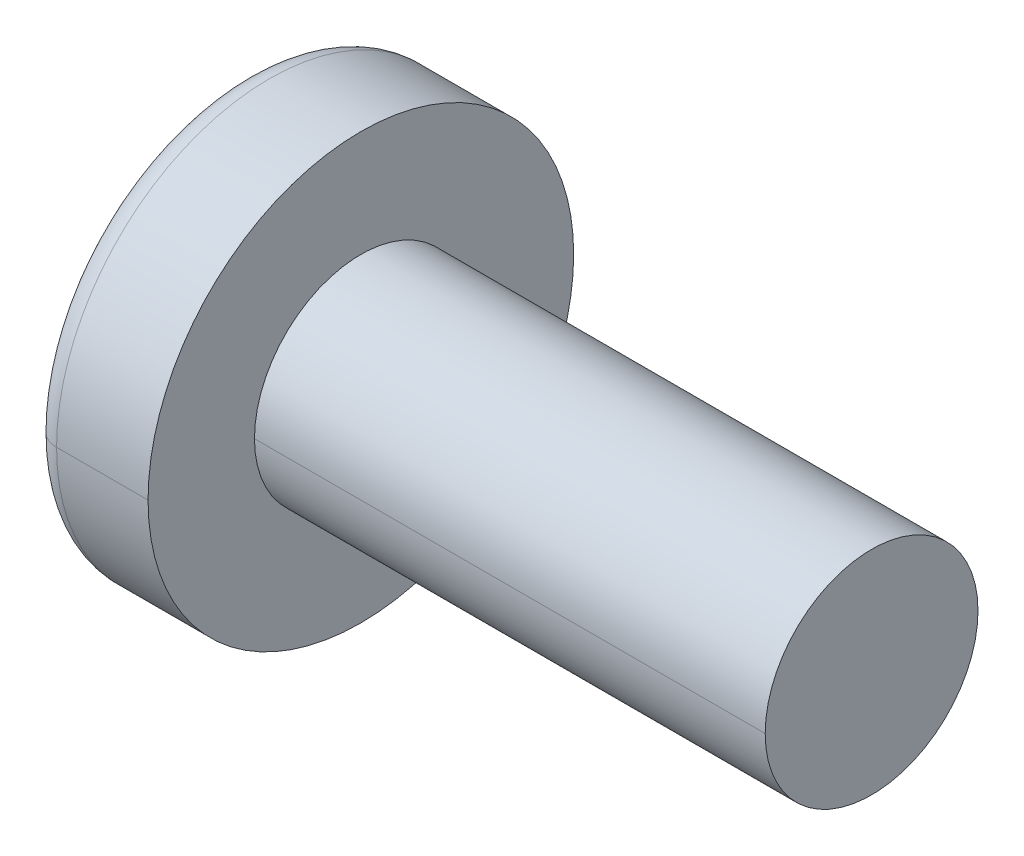
ISO-10303-21;
HEADER;
FILE_DESCRIPTION(('STEP AP214'),'2;1');
FILE_NAME('part.step','',(''),(''),'','','');
FILE_SCHEMA(('AUTOMOTIVE_DESIGN { 1 0 10303 214 1 1 1 1 }'));
ENDSEC;
DATA;
#1=APPLICATION_CONTEXT('core data for automotive mechanical design processes');
#2=APPLICATION_PROTOCOL_DEFINITION('international standard','automotive_design',2000,#1);
#3=PRODUCT_CONTEXT('',#1,'mechanical');
#4=PRODUCT('Part','Part','',(#3));
#5=PRODUCT_RELATED_PRODUCT_CATEGORY('part','',(#4));
#6=PRODUCT_DEFINITION_FORMATION('','',#4);
#7=PRODUCT_DEFINITION_CONTEXT('part definition',#1,'design');
#8=PRODUCT_DEFINITION('design','',#6,#7);
#9=PRODUCT_DEFINITION_SHAPE('','',#8);
#10=(LENGTH_UNIT() NAMED_UNIT(*) SI_UNIT(.MILLI.,.METRE.));
#11=(NAMED_UNIT(*) PLANE_ANGLE_UNIT() SI_UNIT($,.RADIAN.));
#12=(NAMED_UNIT(*) SI_UNIT($,.STERADIAN.) SOLID_ANGLE_UNIT());
#13=UNCERTAINTY_MEASURE_WITH_UNIT(LENGTH_MEASURE(1.E-05),#10,'distance_accuracy_value','');
#14=(GEOMETRIC_REPRESENTATION_CONTEXT(3) GLOBAL_UNCERTAINTY_ASSIGNED_CONTEXT((#13)) GLOBAL_UNIT_ASSIGNED_CONTEXT((#10,
#11,#12)) REPRESENTATION_CONTEXT('',''));
#15=CARTESIAN_POINT('',(0.,0.,0.));
#16=DIRECTION('',(0.,0.,1.));
#17=DIRECTION('',(1.,0.,0.));
#18=AXIS2_PLACEMENT_3D('',#15,#16,#17);
#19=CARTESIAN_POINT('',(1.0251050438713,0.,0.));
#20=DIRECTION('',(-1.,0.,0.));
#21=DIRECTION('',(0.,0.,1.));
#22=AXIS2_PLACEMENT_3D('',#19,#20,#21);
#23=TOROIDAL_SURFACE('',#22,2.2,0.3);
#24=CARTESIAN_POINT('',(1.0251050438713,0.,0.));
#25=DIRECTION('',(-1.,0.,0.));
#26=DIRECTION('',(0.,0.,1.));
#27=AXIS2_PLACEMENT_3D('',#24,#25,#26);
#28=CIRCLE('',#27,2.5);
#29=CARTESIAN_POINT('',(1.0251050438713,0.,2.5));
#30=VERTEX_POINT('',#29);
#31=CARTESIAN_POINT('',(1.0251050438713,0.,-2.5));
#32=VERTEX_POINT('',#31);
#33=EDGE_CURVE('E11',#30,#32,#28,.T.);
#34=ORIENTED_EDGE('',*,*,#33,.T.);
#35=CARTESIAN_POINT('',(1.0251050438713,0.,-2.2));
#36=DIRECTION('',(0.,1.,0.));
#37=DIRECTION('',(0.,0.,1.));
#38=AXIS2_PLACEMENT_3D('',#35,#36,#37);
#39=CIRCLE('',#38,0.3);
#40=CARTESIAN_POINT('',(0.783897344725729,0.,-2.37837837837838));
#41=VERTEX_POINT('',#40);
#42=EDGE_CURVE('E27',#32,#41,#39,.T.);
#43=ORIENTED_EDGE('',*,*,#42,.T.);
#44=CARTESIAN_POINT('',(0.783897344725729,0.,0.));
#45=DIRECTION('',(-1.,0.,0.));
#46=DIRECTION('',(0.,0.,1.));
#47=AXIS2_PLACEMENT_3D('',#44,#45,#46);
#48=CIRCLE('',#47,2.37837837837838);
#49=CARTESIAN_POINT('',(0.783897344725729,2.37837837837838,0.));
#50=VERTEX_POINT('',#49);
#51=EDGE_CURVE('E243',#50,#41,#48,.T.);
#52=ORIENTED_EDGE('',*,*,#51,.F.);
#53=CARTESIAN_POINT('',(0.783897344725729,0.,0.));
#54=DIRECTION('',(-1.,0.,0.));
#55=DIRECTION('',(0.,0.,1.));
#56=AXIS2_PLACEMENT_3D('',#53,#54,#55);
#57=CIRCLE('',#56,2.37837837837838);
#58=CARTESIAN_POINT('',(0.783897344725729,0.,2.37837837837838));
#59=VERTEX_POINT('',#58);
#60=EDGE_CURVE('E294',#59,#50,#57,.T.);
#61=ORIENTED_EDGE('',*,*,#60,.F.);
#62=CARTESIAN_POINT('',(1.0251050438713,0.,2.2));
#63=DIRECTION('',(0.,-1.,0.));
#64=DIRECTION('',(0.,0.,-1.));
#65=AXIS2_PLACEMENT_3D('',#62,#63,#64);
#66=CIRCLE('',#65,0.3);
#67=EDGE_CURVE('E120',#30,#59,#66,.T.);
#68=ORIENTED_EDGE('',*,*,#67,.F.);
#69=EDGE_LOOP('',(#34,#43,#52,#61,#68));
#70=FACE_BOUND('',#69,.T.);
#71=ADVANCED_FACE('F16',(#70),#23,.T.);
#72=CARTESIAN_POINT('',(-25.4,0.,0.));
#73=DIRECTION('',(-1.,0.,0.));
#74=DIRECTION('',(0.,0.,1.));
#75=AXIS2_PLACEMENT_3D('',#72,#73,#74);
#76=CYLINDRICAL_SURFACE('',#75,2.5);
#77=CARTESIAN_POINT('',(2.1,0.,0.));
#78=DIRECTION('',(-1.,0.,0.));
#79=DIRECTION('',(0.,0.,1.));
#80=AXIS2_PLACEMENT_3D('',#77,#78,#79);
#81=CIRCLE('',#80,2.5);
#82=CARTESIAN_POINT('',(2.1,0.,2.5));
#83=VERTEX_POINT('',#82);
#84=CARTESIAN_POINT('',(2.1,0.,-2.5));
#85=VERTEX_POINT('',#84);
#86=EDGE_CURVE('E242',#83,#85,#81,.T.);
#87=ORIENTED_EDGE('',*,*,#86,.T.);
#88=DIRECTION('',(-1.,0.,0.));
#89=VECTOR('',#88,1.);
#90=CARTESIAN_POINT('',(-25.4,0.,-2.5));
#91=LINE('',#90,#89);
#92=EDGE_CURVE('E42',#85,#32,#91,.T.);
#93=ORIENTED_EDGE('',*,*,#92,.T.);
#94=ORIENTED_EDGE('',*,*,#33,.F.);
#95=DIRECTION('',(-1.,0.,0.));
#96=VECTOR('',#95,1.);
#97=CARTESIAN_POINT('',(-25.4,0.,2.5));
#98=LINE('',#97,#96);
#99=EDGE_CURVE('E74',#83,#30,#98,.T.);
#100=ORIENTED_EDGE('',*,*,#99,.F.);
#101=EDGE_LOOP('',(#87,#93,#94,#100));
#102=FACE_BOUND('',#101,.T.);
#103=ADVANCED_FACE('F398',(#102),#76,.T.);
#104=CARTESIAN_POINT('',(-25.4,0.,0.));
#105=DIRECTION('',(-1.,0.,0.));
#106=DIRECTION('',(0.,0.,1.));
#107=AXIS2_PLACEMENT_3D('',#104,#105,#106);
#108=CYLINDRICAL_SURFACE('',#107,1.25);
#109=CARTESIAN_POINT('',(8.1,0.,0.));
#110=DIRECTION('',(-1.,0.,0.));
#111=DIRECTION('',(0.,0.,1.));
#112=AXIS2_PLACEMENT_3D('',#109,#110,#111);
#113=CIRCLE('',#112,1.25);
#114=CARTESIAN_POINT('',(8.1,0.,1.25));
#115=VERTEX_POINT('',#114);
#116=CARTESIAN_POINT('',(8.1,0.,-1.25));
#117=VERTEX_POINT('',#116);
#118=EDGE_CURVE('E263',#115,#117,#113,.T.);
#119=ORIENTED_EDGE('',*,*,#118,.T.);
#120=DIRECTION('',(-1.,0.,0.));
#121=VECTOR('',#120,1.);
#122=CARTESIAN_POINT('',(-25.4,0.,-1.25));
#123=LINE('',#122,#121);
#124=CARTESIAN_POINT('',(2.1,0.,-1.25));
#125=VERTEX_POINT('',#124);
#126=EDGE_CURVE('E91',#117,#125,#123,.T.);
#127=ORIENTED_EDGE('',*,*,#126,.T.);
#128=CARTESIAN_POINT('',(2.1,0.,0.));
#129=DIRECTION('',(-1.,0.,0.));
#130=DIRECTION('',(0.,0.,1.));
#131=AXIS2_PLACEMENT_3D('',#128,#129,#130);
#132=CIRCLE('',#131,1.25);
#133=CARTESIAN_POINT('',(2.1,0.,1.25));
#134=VERTEX_POINT('',#133);
#135=EDGE_CURVE('E206',#134,#125,#132,.T.);
#136=ORIENTED_EDGE('',*,*,#135,.F.);
#137=DIRECTION('',(-1.,0.,0.));
#138=VECTOR('',#137,1.);
#139=CARTESIAN_POINT('',(-25.4,0.,1.25));
#140=LINE('',#139,#138);
#141=EDGE_CURVE('E209',#115,#134,#140,.T.);
#142=ORIENTED_EDGE('',*,*,#141,.F.);
#143=EDGE_LOOP('',(#119,#127,#136,#142));
#144=FACE_BOUND('',#143,.T.);
#145=ADVANCED_FACE('F403',(#144),#108,.T.);
#146=CARTESIAN_POINT('',(4.,0.,0.));
#147=DIRECTION('',(0.,0.,-1.));
#148=DIRECTION('',(0.,1.,0.));
#149=AXIS2_PLACEMENT_3D('',#146,#147,#148);
#150=SPHERICAL_SURFACE('',#149,4.);
#151=ORIENTED_EDGE('',*,*,#51,.T.);
#152=CARTESIAN_POINT('',(0.783897344725729,0.,0.));
#153=DIRECTION('',(-1.,0.,0.));
#154=DIRECTION('',(0.,0.,1.));
#155=AXIS2_PLACEMENT_3D('',#152,#153,#154);
#156=CIRCLE('',#155,2.37837837837838);
#157=CARTESIAN_POINT('',(0.783897344725729,-2.37837837837838,0.));
#158=VERTEX_POINT('',#157);
#159=EDGE_CURVE('E204',#41,#158,#156,.T.);
#160=ORIENTED_EDGE('',*,*,#159,.T.);
#161=CARTESIAN_POINT('',(4.,0.,0.));
#162=DIRECTION('',(0.,0.,-1.));
#163=DIRECTION('',(0.,1.,0.));
#164=AXIS2_PLACEMENT_3D('',#161,#162,#163);
#165=CIRCLE('',#164,4.);
#166=CARTESIAN_POINT('',(0.184169682474742,-1.19976622216793,0.));
#167=VERTEX_POINT('',#166);
#168=EDGE_CURVE('E299',#158,#167,#165,.T.);
#169=ORIENTED_EDGE('',*,*,#168,.T.);
#170=CARTESIAN_POINT('',(3.17784904512421,1.07973473043772,0.));
#171=DIRECTION('',(0.605808178465614,-0.795610740817502,0.));
#172=DIRECTION('',(0.795610740817502,0.605808178465614,0.));
#173=AXIS2_PLACEMENT_3D('',#170,#171,#172);
#174=CIRCLE('',#173,3.76274377539628);
#175=CARTESIAN_POINT('',(0.195539940029891,-1.19110847703606,-0.327634320584817));
#176=VERTEX_POINT('',#175);
#177=EDGE_CURVE('E234',#167,#176,#174,.T.);
#178=ORIENTED_EDGE('',*,*,#177,.T.);
#179=CARTESIAN_POINT('',(3.98786118636742,0.,0.106127913473398));
#180=DIRECTION('',(-0.11363816050966,0.,0.993522203313031));
#181=DIRECTION('',(0.993522203313031,0.,0.11363816050966));
#182=AXIS2_PLACEMENT_3D('',#179,#180,#181);
#183=CIRCLE('',#182,3.99857343501221);
#184=CARTESIAN_POINT('',(0.0301382525496399,-0.346552814250857,-0.346552814250858));
#185=VERTEX_POINT('',#184);
#186=EDGE_CURVE('E191',#185,#176,#183,.T.);
#187=ORIENTED_EDGE('',*,*,#186,.F.);
#188=CARTESIAN_POINT('',(3.98786118636742,0.106127913473398,0.));
#189=DIRECTION('',(-0.11363816050966,0.993522203313031,0.));
#190=DIRECTION('',(-0.993522203313031,-0.11363816050966,0.));
#191=AXIS2_PLACEMENT_3D('',#188,#189,#190);
#192=CIRCLE('',#191,3.99857343501221);
#193=CARTESIAN_POINT('',(0.195539940029892,-0.327634320584812,-1.19110847703606));
#194=VERTEX_POINT('',#193);
#195=EDGE_CURVE('E264',#194,#185,#192,.T.);
#196=ORIENTED_EDGE('',*,*,#195,.F.);
#197=CARTESIAN_POINT('',(3.17784904512422,0.,1.07973473043772));
#198=DIRECTION('',(0.605808178465614,0.,-0.795610740817502));
#199=DIRECTION('',(-0.795610740817502,0.,-0.605808178465614));
#200=AXIS2_PLACEMENT_3D('',#197,#198,#199);
#201=CIRCLE('',#200,3.76274377539628);
#202=CARTESIAN_POINT('',(0.195539940029893,0.327634320584821,-1.19110847703606));
#203=VERTEX_POINT('',#202);
#204=EDGE_CURVE('E230',#194,#203,#201,.T.);
#205=ORIENTED_EDGE('',*,*,#204,.T.);
#206=CARTESIAN_POINT('',(3.98786118636742,-0.106127913473398,0.));
#207=DIRECTION('',(-0.11363816050966,-0.993522203313031,0.));
#208=DIRECTION('',(0.993522203313031,-0.11363816050966,0.));
#209=AXIS2_PLACEMENT_3D('',#206,#207,#208);
#210=CIRCLE('',#209,3.99857343501221);
#211=CARTESIAN_POINT('',(0.0301382525496408,0.34655281425086,-0.346552814250858));
#212=VERTEX_POINT('',#211);
#213=EDGE_CURVE('E268',#212,#203,#210,.T.);
#214=ORIENTED_EDGE('',*,*,#213,.F.);
#215=CARTESIAN_POINT('',(3.98786118636742,0.,0.106127913473398));
#216=DIRECTION('',(-0.11363816050966,0.,0.993522203313031));
#217=DIRECTION('',(0.993522203313031,0.,0.11363816050966));
#218=AXIS2_PLACEMENT_3D('',#215,#216,#217);
#219=CIRCLE('',#218,3.99857343501221);
#220=CARTESIAN_POINT('',(0.195539940029893,1.19110847703606,-0.327634320584816));
#221=VERTEX_POINT('',#220);
#222=EDGE_CURVE('E229',#221,#212,#219,.T.);
#223=ORIENTED_EDGE('',*,*,#222,.F.);
#224=CARTESIAN_POINT('',(3.17784904512422,-1.07973473043772,0.));
#225=DIRECTION('',(0.605808178465614,0.795610740817502,0.));
#226=DIRECTION('',(-0.795610740817502,0.605808178465614,0.));
#227=AXIS2_PLACEMENT_3D('',#224,#225,#226);
#228=CIRCLE('',#227,3.76274377539628);
#229=CARTESIAN_POINT('',(0.184169682474743,1.19976622216792,0.));
#230=VERTEX_POINT('',#229);
#231=EDGE_CURVE('E235',#221,#230,#228,.T.);
#232=ORIENTED_EDGE('',*,*,#231,.T.);
#233=CARTESIAN_POINT('',(4.,0.,0.));
#234=DIRECTION('',(0.,0.,1.));
#235=DIRECTION('',(1.,0.,0.));
#236=AXIS2_PLACEMENT_3D('',#233,#234,#235);
#237=CIRCLE('',#236,4.);
#238=EDGE_CURVE('E156',#50,#230,#237,.T.);
#239=ORIENTED_EDGE('',*,*,#238,.F.);
#240=EDGE_LOOP('',(#151,#160,#169,#178,#187,#196,#205,#214,#223,#232,#239));
#241=FACE_BOUND('',#240,.T.);
#242=ADVANCED_FACE('F331',(#241),#150,.T.);
#243=CARTESIAN_POINT('',(4.,0.,0.));
#244=DIRECTION('',(0.,0.,-1.));
#245=DIRECTION('',(0.,1.,0.));
#246=AXIS2_PLACEMENT_3D('',#243,#244,#245);
#247=SPHERICAL_SURFACE('',#246,4.);
#248=ORIENTED_EDGE('',*,*,#168,.F.);
#249=CARTESIAN_POINT('',(0.783897344725729,0.,0.));
#250=DIRECTION('',(-1.,0.,0.));
#251=DIRECTION('',(0.,0.,1.));
#252=AXIS2_PLACEMENT_3D('',#249,#250,#251);
#253=CIRCLE('',#252,2.37837837837838);
#254=EDGE_CURVE('E280',#158,#59,#253,.T.);
#255=ORIENTED_EDGE('',*,*,#254,.T.);
#256=ORIENTED_EDGE('',*,*,#60,.T.);
#257=ORIENTED_EDGE('',*,*,#238,.T.);
#258=CARTESIAN_POINT('',(3.17784904512422,-1.07973473043772,0.));
#259=DIRECTION('',(0.605808178465614,0.795610740817502,0.));
#260=DIRECTION('',(-0.795610740817502,0.605808178465614,0.));
#261=AXIS2_PLACEMENT_3D('',#258,#259,#260);
#262=CIRCLE('',#261,3.76274377539628);
#263=CARTESIAN_POINT('',(0.195539940029893,1.19110847703606,0.327634320584816));
#264=VERTEX_POINT('',#263);
#265=EDGE_CURVE('E178',#230,#264,#262,.T.);
#266=ORIENTED_EDGE('',*,*,#265,.T.);
#267=CARTESIAN_POINT('',(3.98786118636742,0.,-0.106127913473398));
#268=DIRECTION('',(-0.11363816050966,0.,-0.993522203313031));
#269=DIRECTION('',(-0.993522203313031,0.,0.11363816050966));
#270=AXIS2_PLACEMENT_3D('',#267,#268,#269);
#271=CIRCLE('',#270,3.99857343501221);
#272=CARTESIAN_POINT('',(0.0301382525496408,0.346552814250857,0.346552814250858));
#273=VERTEX_POINT('',#272);
#274=EDGE_CURVE('E166',#273,#264,#271,.T.);
#275=ORIENTED_EDGE('',*,*,#274,.F.);
#276=CARTESIAN_POINT('',(3.98786118636742,-0.106127913473398,0.));
#277=DIRECTION('',(-0.11363816050966,-0.993522203313031,0.));
#278=DIRECTION('',(0.993522203313031,-0.11363816050966,0.));
#279=AXIS2_PLACEMENT_3D('',#276,#277,#278);
#280=CIRCLE('',#279,3.99857343501221);
#281=CARTESIAN_POINT('',(0.195539940029893,0.327634320584812,1.19110847703606));
#282=VERTEX_POINT('',#281);
#283=EDGE_CURVE('E20',#282,#273,#280,.T.);
#284=ORIENTED_EDGE('',*,*,#283,.F.);
#285=CARTESIAN_POINT('',(3.17784904512422,0.,-1.07973473043772));
#286=DIRECTION('',(0.605808178465614,0.,0.795610740817502));
#287=DIRECTION('',(0.795610740817502,0.,-0.605808178465614));
#288=AXIS2_PLACEMENT_3D('',#285,#286,#287);
#289=CIRCLE('',#288,3.76274377539628);
#290=CARTESIAN_POINT('',(0.195539940029892,-0.327634320584821,1.19110847703606));
#291=VERTEX_POINT('',#290);
#292=EDGE_CURVE('E183',#282,#291,#289,.T.);
#293=ORIENTED_EDGE('',*,*,#292,.T.);
#294=CARTESIAN_POINT('',(3.98786118636742,0.106127913473398,0.));
#295=DIRECTION('',(-0.11363816050966,0.993522203313031,0.));
#296=DIRECTION('',(-0.993522203313031,-0.11363816050966,0.));
#297=AXIS2_PLACEMENT_3D('',#294,#295,#296);
#298=CIRCLE('',#297,3.99857343501221);
#299=CARTESIAN_POINT('',(0.0301382525496399,-0.34655281425086,0.346552814250858));
#300=VERTEX_POINT('',#299);
#301=EDGE_CURVE('E273',#300,#291,#298,.T.);
#302=ORIENTED_EDGE('',*,*,#301,.F.);
#303=CARTESIAN_POINT('',(3.98786118636742,0.,-0.106127913473398));
#304=DIRECTION('',(-0.11363816050966,0.,-0.993522203313031));
#305=DIRECTION('',(-0.993522203313031,0.,0.11363816050966));
#306=AXIS2_PLACEMENT_3D('',#303,#304,#305);
#307=CIRCLE('',#306,3.99857343501221);
#308=CARTESIAN_POINT('',(0.195539940029891,-1.19110847703606,0.327634320584816));
#309=VERTEX_POINT('',#308);
#310=EDGE_CURVE('E175',#309,#300,#307,.T.);
#311=ORIENTED_EDGE('',*,*,#310,.F.);
#312=CARTESIAN_POINT('',(3.17784904512421,1.07973473043772,0.));
#313=DIRECTION('',(0.605808178465614,-0.795610740817502,0.));
#314=DIRECTION('',(0.795610740817502,0.605808178465614,0.));
#315=AXIS2_PLACEMENT_3D('',#312,#313,#314);
#316=CIRCLE('',#315,3.76274377539628);
#317=EDGE_CURVE('E295',#309,#167,#316,.T.);
#318=ORIENTED_EDGE('',*,*,#317,.T.);
#319=EDGE_LOOP('',(#248,#255,#256,#257,#266,#275,#284,#293,#302,#311,#318));
#320=FACE_BOUND('',#319,.T.);
#321=ADVANCED_FACE('F179',(#320),#247,.T.);
#322=CARTESIAN_POINT('',(1.75982832618026,0.,-0.148712446351931));
#323=DIRECTION('',(-0.11363816050966,0.,0.993522203313031));
#324=DIRECTION('',(0.,1.,0.));
#325=AXIS2_PLACEMENT_3D('',#322,#323,#324);
#326=PLANE('',#325);
#327=ORIENTED_EDGE('',*,*,#222,.T.);
#328=DIRECTION('',(0.987168682960152,-0.112911450665377,0.112911450665377));
#329=VECTOR('',#328,1.);
#330=CARTESIAN_POINT('',(1.77640420924781,0.146816512014139,-0.146816512014139));
#331=LINE('',#330,#329);
#332=CARTESIAN_POINT('',(1.53,0.175,-0.175));
#333=VERTEX_POINT('',#332);
#334=EDGE_CURVE('E225',#212,#333,#331,.T.);
#335=ORIENTED_EDGE('',*,*,#334,.T.);
#336=DIRECTION('',(0.792336746135061,-0.603315234802187,0.0906267520089122));
#337=VECTOR('',#336,1.);
#338=CARTESIAN_POINT('',(0.,1.34,-0.35));
#339=LINE('',#338,#337);
#340=EDGE_CURVE('E219',#221,#333,#339,.T.);
#341=ORIENTED_EDGE('',*,*,#340,.F.);
#342=EDGE_LOOP('',(#327,#335,#341));
#343=FACE_BOUND('',#342,.T.);
#344=ADVANCED_FACE('F380',(#343),#326,.T.);
#345=CARTESIAN_POINT('',(1.75982832618026,0.,-0.148712446351931));
#346=DIRECTION('',(-0.11363816050966,0.,0.993522203313031));
#347=DIRECTION('',(0.,1.,0.));
#348=AXIS2_PLACEMENT_3D('',#345,#346,#347);
#349=PLANE('',#348);
#350=DIRECTION('',(0.792336746135061,0.603315234802187,0.0906267520089122));
#351=VECTOR('',#350,1.);
#352=CARTESIAN_POINT('',(0.,-1.34,-0.35));
#353=LINE('',#352,#351);
#354=CARTESIAN_POINT('',(1.53,-0.175,-0.175));
#355=VERTEX_POINT('',#354);
#356=EDGE_CURVE('E213',#176,#355,#353,.T.);
#357=ORIENTED_EDGE('',*,*,#356,.T.);
#358=DIRECTION('',(-0.987168682960152,-0.112911450665376,-0.112911450665377));
#359=VECTOR('',#358,1.);
#360=CARTESIAN_POINT('',(1.77640420924781,-0.146816512014138,-0.146816512014139));
#361=LINE('',#360,#359);
#362=EDGE_CURVE('E199',#355,#185,#361,.T.);
#363=ORIENTED_EDGE('',*,*,#362,.T.);
#364=ORIENTED_EDGE('',*,*,#186,.T.);
#365=EDGE_LOOP('',(#357,#363,#364));
#366=FACE_BOUND('',#365,.T.);
#367=ADVANCED_FACE('F18',(#366),#349,.T.);
#368=CARTESIAN_POINT('',(1.75982832618026,0.,0.148712446351931));
#369=DIRECTION('',(-0.11363816050966,0.,-0.993522203313031));
#370=DIRECTION('',(-0.993522203313031,0.,0.11363816050966));
#371=AXIS2_PLACEMENT_3D('',#368,#369,#370);
#372=PLANE('',#371);
#373=DIRECTION('',(0.792336746135061,-0.603315234802187,-0.0906267520089122));
#374=VECTOR('',#373,1.);
#375=CARTESIAN_POINT('',(0.,1.34,0.35));
#376=LINE('',#375,#374);
#377=CARTESIAN_POINT('',(1.53,0.175,0.175));
#378=VERTEX_POINT('',#377);
#379=EDGE_CURVE('E169',#264,#378,#376,.T.);
#380=ORIENTED_EDGE('',*,*,#379,.T.);
#381=DIRECTION('',(-0.987168682960152,0.112911450665376,0.112911450665377));
#382=VECTOR('',#381,1.);
#383=CARTESIAN_POINT('',(1.77640420924781,0.146816512014138,0.146816512014139));
#384=LINE('',#383,#382);
#385=EDGE_CURVE('E172',#378,#273,#384,.T.);
#386=ORIENTED_EDGE('',*,*,#385,.T.);
#387=ORIENTED_EDGE('',*,*,#274,.T.);
#388=EDGE_LOOP('',(#380,#386,#387));
#389=FACE_BOUND('',#388,.T.);
#390=ADVANCED_FACE('F167',(#389),#372,.T.);
#391=CARTESIAN_POINT('',(1.75982832618026,0.,0.148712446351931));
#392=DIRECTION('',(-0.11363816050966,0.,-0.993522203313031));
#393=DIRECTION('',(-0.993522203313031,0.,0.11363816050966));
#394=AXIS2_PLACEMENT_3D('',#391,#392,#393);
#395=PLANE('',#394);
#396=ORIENTED_EDGE('',*,*,#310,.T.);
#397=DIRECTION('',(0.987168682960152,0.112911450665377,-0.112911450665377));
#398=VECTOR('',#397,1.);
#399=CARTESIAN_POINT('',(1.77640420924781,-0.14681651201414,0.146816512014139));
#400=LINE('',#399,#398);
#401=CARTESIAN_POINT('',(1.53,-0.175,0.175));
#402=VERTEX_POINT('',#401);
#403=EDGE_CURVE('E238',#300,#402,#400,.T.);
#404=ORIENTED_EDGE('',*,*,#403,.T.);
#405=DIRECTION('',(0.792336746135061,0.603315234802187,-0.0906267520089121));
#406=VECTOR('',#405,1.);
#407=CARTESIAN_POINT('',(0.,-1.34,0.35));
#408=LINE('',#407,#406);
#409=EDGE_CURVE('E215',#309,#402,#408,.T.);
#410=ORIENTED_EDGE('',*,*,#409,.F.);
#411=EDGE_LOOP('',(#396,#404,#410));
#412=FACE_BOUND('',#411,.T.);
#413=ADVANCED_FACE('F414',(#412),#395,.T.);
#414=CARTESIAN_POINT('',(-25.4,0.,0.));
#415=DIRECTION('',(-1.,0.,0.));
#416=DIRECTION('',(0.,0.,1.));
#417=AXIS2_PLACEMENT_3D('',#414,#415,#416);
#418=CYLINDRICAL_SURFACE('',#417,1.25);
#419=ORIENTED_EDGE('',*,*,#126,.F.);
#420=CARTESIAN_POINT('',(8.1,0.,0.));
#421=DIRECTION('',(-1.,0.,0.));
#422=DIRECTION('',(0.,0.,1.));
#423=AXIS2_PLACEMENT_3D('',#420,#421,#422);
#424=CIRCLE('',#423,1.25);
#425=EDGE_CURVE('E224',#117,#115,#424,.T.);
#426=ORIENTED_EDGE('',*,*,#425,.T.);
#427=ORIENTED_EDGE('',*,*,#141,.T.);
#428=CARTESIAN_POINT('',(2.1,0.,0.));
#429=DIRECTION('',(-1.,0.,0.));
#430=DIRECTION('',(0.,0.,1.));
#431=AXIS2_PLACEMENT_3D('',#428,#429,#430);
#432=CIRCLE('',#431,1.25);
#433=EDGE_CURVE('E210',#125,#134,#432,.T.);
#434=ORIENTED_EDGE('',*,*,#433,.F.);
#435=EDGE_LOOP('',(#419,#426,#427,#434));
#436=FACE_BOUND('',#435,.T.);
#437=ADVANCED_FACE('F417',(#436),#418,.T.);
#438=CARTESIAN_POINT('',(2.1,1.25,0.));
#439=DIRECTION('',(-1.,0.,0.));
#440=DIRECTION('',(0.,0.,1.));
#441=AXIS2_PLACEMENT_3D('',#438,#439,#440);
#442=PLANE('',#441);
#443=ORIENTED_EDGE('',*,*,#86,.F.);
#444=CARTESIAN_POINT('',(2.1,0.,0.));
#445=DIRECTION('',(-1.,0.,0.));
#446=DIRECTION('',(0.,0.,1.));
#447=AXIS2_PLACEMENT_3D('',#444,#445,#446);
#448=CIRCLE('',#447,2.5);
#449=EDGE_CURVE('E281',#85,#83,#448,.T.);
#450=ORIENTED_EDGE('',*,*,#449,.F.);
#451=EDGE_LOOP('',(#443,#450));
#452=FACE_BOUND('',#451,.T.);
#453=ORIENTED_EDGE('',*,*,#135,.T.);
#454=ORIENTED_EDGE('',*,*,#433,.T.);
#455=EDGE_LOOP('',(#453,#454));
#456=FACE_BOUND('',#455,.T.);
#457=ADVANCED_FACE('F430',(#452,#456),#442,.F.);
#458=CARTESIAN_POINT('',(-25.4,0.,0.));
#459=DIRECTION('',(-1.,0.,0.));
#460=DIRECTION('',(0.,0.,1.));
#461=AXIS2_PLACEMENT_3D('',#458,#459,#460);
#462=CYLINDRICAL_SURFACE('',#461,2.5);
#463=ORIENTED_EDGE('',*,*,#92,.F.);
#464=ORIENTED_EDGE('',*,*,#449,.T.);
#465=ORIENTED_EDGE('',*,*,#99,.T.);
#466=CARTESIAN_POINT('',(1.0251050438713,0.,0.));
#467=DIRECTION('',(-1.,0.,0.));
#468=DIRECTION('',(0.,0.,1.));
#469=AXIS2_PLACEMENT_3D('',#466,#467,#468);
#470=CIRCLE('',#469,2.5);
#471=EDGE_CURVE('E255',#32,#30,#470,.T.);
#472=ORIENTED_EDGE('',*,*,#471,.F.);
#473=EDGE_LOOP('',(#463,#464,#465,#472));
#474=FACE_BOUND('',#473,.T.);
#475=ADVANCED_FACE('F428',(#474),#462,.T.);
#476=CARTESIAN_POINT('',(1.0251050438713,0.,0.));
#477=DIRECTION('',(-1.,0.,0.));
#478=DIRECTION('',(0.,0.,1.));
#479=AXIS2_PLACEMENT_3D('',#476,#477,#478);
#480=TOROIDAL_SURFACE('',#479,2.2,0.3);
#481=ORIENTED_EDGE('',*,*,#42,.F.);
#482=ORIENTED_EDGE('',*,*,#471,.T.);
#483=ORIENTED_EDGE('',*,*,#67,.T.);
#484=ORIENTED_EDGE('',*,*,#254,.F.);
#485=ORIENTED_EDGE('',*,*,#159,.F.);
#486=EDGE_LOOP('',(#481,#482,#483,#484,#485));
#487=FACE_BOUND('',#486,.T.);
#488=ADVANCED_FACE('F407',(#487),#480,.T.);
#489=CARTESIAN_POINT('',(8.1,1.25,0.));
#490=DIRECTION('',(1.,0.,0.));
#491=DIRECTION('',(0.,1.,0.));
#492=AXIS2_PLACEMENT_3D('',#489,#490,#491);
#493=PLANE('',#492);
#494=ORIENTED_EDGE('',*,*,#118,.F.);
#495=ORIENTED_EDGE('',*,*,#425,.F.);
#496=EDGE_LOOP('',(#494,#495));
#497=FACE_BOUND('',#496,.T.);
#498=ADVANCED_FACE('F410',(#497),#493,.T.);
#499=CARTESIAN_POINT('',(1.53,0.175,0.175));
#500=DIRECTION('',(0.605808178465614,0.795610740817502,0.));
#501=DIRECTION('',(0.,0.,-1.));
#502=AXIS2_PLACEMENT_3D('',#499,#500,#501);
#503=PLANE('',#502);
#504=ORIENTED_EDGE('',*,*,#340,.T.);
#505=DIRECTION('',(0.,0.,-1.));
#506=VECTOR('',#505,1.);
#507=CARTESIAN_POINT('',(1.53,0.175,0.175));
#508=LINE('',#507,#506);
#509=EDGE_CURVE('E189',#378,#333,#508,.T.);
#510=ORIENTED_EDGE('',*,*,#509,.F.);
#511=ORIENTED_EDGE('',*,*,#379,.F.);
#512=ORIENTED_EDGE('',*,*,#265,.F.);
#513=ORIENTED_EDGE('',*,*,#231,.F.);
#514=EDGE_LOOP('',(#504,#510,#511,#512,#513));
#515=FACE_BOUND('',#514,.T.);
#516=ADVANCED_FACE('F187',(#515),#503,.F.);
#517=CARTESIAN_POINT('',(1.53,-0.175,-0.175));
#518=DIRECTION('',(0.605808178465614,-0.795610740817502,0.));
#519=DIRECTION('',(0.,0.,-1.));
#520=AXIS2_PLACEMENT_3D('',#517,#518,#519);
#521=PLANE('',#520);
#522=ORIENTED_EDGE('',*,*,#409,.T.);
#523=DIRECTION('',(0.,0.,1.));
#524=VECTOR('',#523,1.);
#525=CARTESIAN_POINT('',(1.53,-0.175,-0.175));
#526=LINE('',#525,#524);
#527=EDGE_CURVE('E220',#355,#402,#526,.T.);
#528=ORIENTED_EDGE('',*,*,#527,.F.);
#529=ORIENTED_EDGE('',*,*,#356,.F.);
#530=ORIENTED_EDGE('',*,*,#177,.F.);
#531=ORIENTED_EDGE('',*,*,#317,.F.);
#532=EDGE_LOOP('',(#522,#528,#529,#530,#531));
#533=FACE_BOUND('',#532,.T.);
#534=ADVANCED_FACE('F340',(#533),#521,.F.);
#535=CARTESIAN_POINT('',(1.53,0.175,-0.175));
#536=DIRECTION('',(-1.,0.,0.));
#537=DIRECTION('',(0.,0.,1.));
#538=AXIS2_PLACEMENT_3D('',#535,#536,#537);
#539=PLANE('',#538);
#540=DIRECTION('',(0.,1.,0.));
#541=VECTOR('',#540,1.);
#542=CARTESIAN_POINT('',(1.53,-0.175,-0.175));
#543=LINE('',#542,#541);
#544=EDGE_CURVE('E254',#355,#333,#543,.T.);
#545=ORIENTED_EDGE('',*,*,#544,.F.);
#546=ORIENTED_EDGE('',*,*,#527,.T.);
#547=DIRECTION('',(0.,-1.,0.));
#548=VECTOR('',#547,1.);
#549=CARTESIAN_POINT('',(1.53,0.175,0.175));
#550=LINE('',#549,#548);
#551=EDGE_CURVE('E246',#378,#402,#550,.T.);
#552=ORIENTED_EDGE('',*,*,#551,.F.);
#553=ORIENTED_EDGE('',*,*,#509,.T.);
#554=EDGE_LOOP('',(#545,#546,#552,#553));
#555=FACE_BOUND('',#554,.T.);
#556=ADVANCED_FACE('F419',(#555),#539,.T.);
#557=CARTESIAN_POINT('',(1.53,0.175,-0.175));
#558=DIRECTION('',(0.605808178465614,0.,-0.795610740817502));
#559=DIRECTION('',(0.,-1.,0.));
#560=AXIS2_PLACEMENT_3D('',#557,#558,#559);
#561=PLANE('',#560);
#562=DIRECTION('',(0.792336746135061,0.09062675200891,0.603315234802188));
#563=VECTOR('',#562,1.);
#564=CARTESIAN_POINT('',(0.,-0.349999999999995,-1.34));
#565=LINE('',#564,#563);
#566=EDGE_CURVE('E250',#194,#355,#565,.T.);
#567=ORIENTED_EDGE('',*,*,#566,.T.);
#568=ORIENTED_EDGE('',*,*,#544,.T.);
#569=DIRECTION('',(0.792336746135061,-0.0906267520089144,0.603315234802187));
#570=VECTOR('',#569,1.);
#571=CARTESIAN_POINT('',(0.,0.350000000000004,-1.34));
#572=LINE('',#571,#570);
#573=EDGE_CURVE('E260',#203,#333,#572,.T.);
#574=ORIENTED_EDGE('',*,*,#573,.F.);
#575=ORIENTED_EDGE('',*,*,#204,.F.);
#576=EDGE_LOOP('',(#567,#568,#574,#575));
#577=FACE_BOUND('',#576,.T.);
#578=ADVANCED_FACE('F347',(#577),#561,.F.);
#579=CARTESIAN_POINT('',(1.75982832618026,-0.148712446351931,0.));
#580=DIRECTION('',(-0.11363816050966,0.993522203313031,0.));
#581=DIRECTION('',(0.,0.,1.));
#582=AXIS2_PLACEMENT_3D('',#579,#580,#581);
#583=PLANE('',#582);
#584=ORIENTED_EDGE('',*,*,#195,.T.);
#585=ORIENTED_EDGE('',*,*,#362,.F.);
#586=ORIENTED_EDGE('',*,*,#566,.F.);
#587=EDGE_LOOP('',(#584,#585,#586));
#588=FACE_BOUND('',#587,.T.);
#589=ADVANCED_FACE('F350',(#588),#583,.T.);
#590=CARTESIAN_POINT('',(1.75982832618026,0.148712446351931,0.));
#591=DIRECTION('',(-0.11363816050966,-0.993522203313031,0.));
#592=DIRECTION('',(-0.993522203313031,0.11363816050966,0.));
#593=AXIS2_PLACEMENT_3D('',#590,#591,#592);
#594=PLANE('',#593);
#595=ORIENTED_EDGE('',*,*,#213,.T.);
#596=ORIENTED_EDGE('',*,*,#573,.T.);
#597=ORIENTED_EDGE('',*,*,#334,.F.);
#598=EDGE_LOOP('',(#595,#596,#597));
#599=FACE_BOUND('',#598,.T.);
#600=ADVANCED_FACE('F383',(#599),#594,.T.);
#601=CARTESIAN_POINT('',(1.53,-0.175,0.175));
#602=DIRECTION('',(0.605808178465614,0.,0.795610740817502));
#603=DIRECTION('',(0.,-1.,0.));
#604=AXIS2_PLACEMENT_3D('',#601,#602,#603);
#605=PLANE('',#604);
#606=DIRECTION('',(0.792336746135061,-0.0906267520089101,-0.603315234802188));
#607=VECTOR('',#606,1.);
#608=CARTESIAN_POINT('',(0.,0.349999999999995,1.34));
#609=LINE('',#608,#607);
#610=EDGE_CURVE('E249',#282,#378,#609,.T.);
#611=ORIENTED_EDGE('',*,*,#610,.T.);
#612=ORIENTED_EDGE('',*,*,#551,.T.);
#613=DIRECTION('',(0.792336746135061,0.0906267520089144,-0.603315234802187));
#614=VECTOR('',#613,1.);
#615=CARTESIAN_POINT('',(0.,-0.350000000000004,1.34));
#616=LINE('',#615,#614);
#617=EDGE_CURVE('E269',#291,#402,#616,.T.);
#618=ORIENTED_EDGE('',*,*,#617,.F.);
#619=ORIENTED_EDGE('',*,*,#292,.F.);
#620=EDGE_LOOP('',(#611,#612,#618,#619));
#621=FACE_BOUND('',#620,.T.);
#622=ADVANCED_FACE('F385',(#621),#605,.F.);
#623=CARTESIAN_POINT('',(1.75982832618026,0.148712446351931,0.));
#624=DIRECTION('',(-0.11363816050966,-0.993522203313031,0.));
#625=DIRECTION('',(-0.993522203313031,0.11363816050966,0.));
#626=AXIS2_PLACEMENT_3D('',#623,#624,#625);
#627=PLANE('',#626);
#628=ORIENTED_EDGE('',*,*,#283,.T.);
#629=ORIENTED_EDGE('',*,*,#385,.F.);
#630=ORIENTED_EDGE('',*,*,#610,.F.);
#631=EDGE_LOOP('',(#628,#629,#630));
#632=FACE_BOUND('',#631,.T.);
#633=ADVANCED_FACE('F392',(#632),#627,.T.);
#634=CARTESIAN_POINT('',(1.75982832618026,-0.148712446351931,0.));
#635=DIRECTION('',(-0.11363816050966,0.993522203313031,0.));
#636=DIRECTION('',(0.,0.,1.));
#637=AXIS2_PLACEMENT_3D('',#634,#635,#636);
#638=PLANE('',#637);
#639=ORIENTED_EDGE('',*,*,#301,.T.);
#640=ORIENTED_EDGE('',*,*,#617,.T.);
#641=ORIENTED_EDGE('',*,*,#403,.F.);
#642=EDGE_LOOP('',(#639,#640,#641));
#643=FACE_BOUND('',#642,.T.);
#644=ADVANCED_FACE('F464',(#643),#638,.T.);
#645=CLOSED_SHELL('',(#71,#103,#145,#242,#321,#344,#367,#390,#413,#437,#457,#475,#488,#498,#516,
#534,#556,#578,#589,#600,#622,#633,#644));
#646=MANIFOLD_SOLID_BREP('B1',#645);
#647=ADVANCED_BREP_SHAPE_REPRESENTATION('',(#18,#646),#14);
#648=SHAPE_DEFINITION_REPRESENTATION(#9,#647);
ENDSEC;
END-ISO-10303-21;
